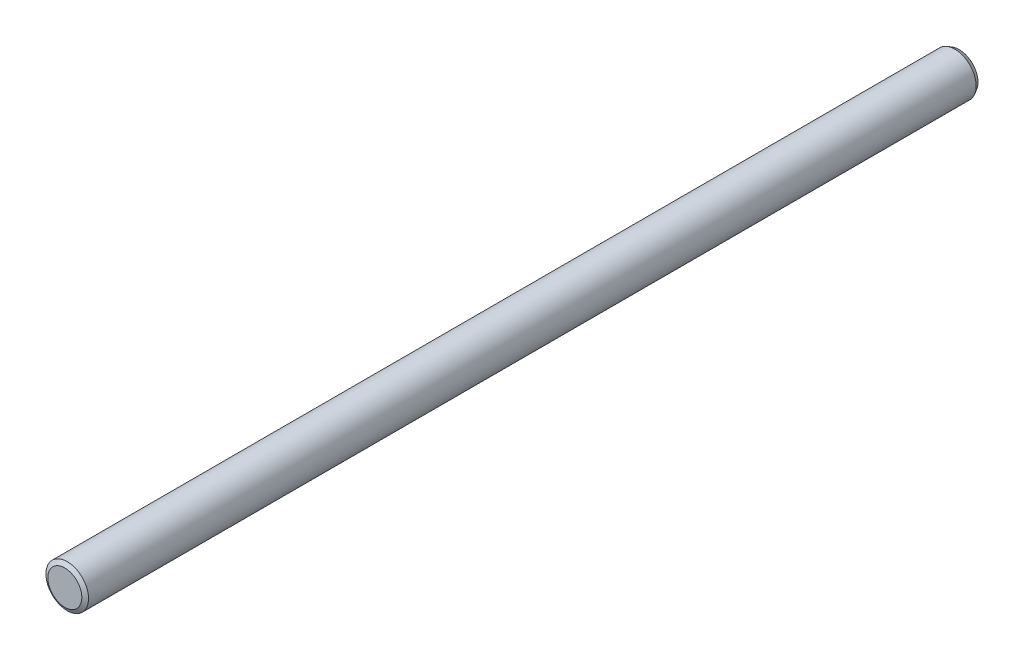
ISO-10303-21;
HEADER;
FILE_DESCRIPTION(('STEP AP214'),'2;1');
FILE_NAME('part.step','',(''),(''),'','','');
FILE_SCHEMA(('AUTOMOTIVE_DESIGN { 1 0 10303 214 1 1 1 1 }'));
ENDSEC;
DATA;
#1=APPLICATION_CONTEXT('core data for automotive mechanical design processes');
#2=APPLICATION_PROTOCOL_DEFINITION('international standard','automotive_design',2000,#1);
#3=PRODUCT_CONTEXT('',#1,'mechanical');
#4=PRODUCT('Part','Part','',(#3));
#5=PRODUCT_RELATED_PRODUCT_CATEGORY('part','',(#4));
#6=PRODUCT_DEFINITION_FORMATION('','',#4);
#7=PRODUCT_DEFINITION_CONTEXT('part definition',#1,'design');
#8=PRODUCT_DEFINITION('design','',#6,#7);
#9=PRODUCT_DEFINITION_SHAPE('','',#8);
#10=(LENGTH_UNIT() NAMED_UNIT(*) SI_UNIT(.MILLI.,.METRE.));
#11=(NAMED_UNIT(*) PLANE_ANGLE_UNIT() SI_UNIT($,.RADIAN.));
#12=(NAMED_UNIT(*) SI_UNIT($,.STERADIAN.) SOLID_ANGLE_UNIT());
#13=UNCERTAINTY_MEASURE_WITH_UNIT(LENGTH_MEASURE(1.E-05),#10,'distance_accuracy_value','');
#14=(GEOMETRIC_REPRESENTATION_CONTEXT(3) GLOBAL_UNCERTAINTY_ASSIGNED_CONTEXT((#13)) GLOBAL_UNIT_ASSIGNED_CONTEXT((#10,
#11,#12)) REPRESENTATION_CONTEXT('',''));
#15=CARTESIAN_POINT('',(0.,0.,0.));
#16=DIRECTION('',(0.,0.,1.));
#17=DIRECTION('',(1.,0.,0.));
#18=AXIS2_PLACEMENT_3D('',#15,#16,#17);
#19=CARTESIAN_POINT('',(0.25,20.5091406768537,10.5));
#20=DIRECTION('',(0.,0.,-1.));
#21=DIRECTION('',(-1.,0.,0.));
#22=AXIS2_PLACEMENT_3D('',#19,#20,#21);
#23=CYLINDRICAL_SURFACE('',#22,0.25);
#24=CARTESIAN_POINT('',(0.25,20.5091406768537,10.4711324865405));
#25=DIRECTION('',(0.,0.,1.));
#26=DIRECTION('',(1.,0.,0.));
#27=AXIS2_PLACEMENT_3D('',#24,#25,#26);
#28=CIRCLE('',#27,0.25);
#29=CARTESIAN_POINT('',(0.5,20.5091406768537,10.4711324865405));
#30=VERTEX_POINT('',#29);
#31=EDGE_CURVE('E37',#30,#30,#28,.F.);
#32=ORIENTED_EDGE('',*,*,#31,.T.);
#33=EDGE_LOOP('',(#32));
#34=FACE_BOUND('',#33,.T.);
#35=CARTESIAN_POINT('',(0.25,20.5091406768537,0.0499999999999962));
#36=DIRECTION('',(0.,0.,1.));
#37=DIRECTION('',(1.,0.,0.));
#38=AXIS2_PLACEMENT_3D('',#35,#36,#37);
#39=CIRCLE('',#38,0.25);
#40=CARTESIAN_POINT('',(0.5,20.5091406768537,0.0499999999999962));
#41=VERTEX_POINT('',#40);
#42=EDGE_CURVE('E41',#41,#41,#39,.T.);
#43=ORIENTED_EDGE('',*,*,#42,.T.);
#44=EDGE_LOOP('',(#43));
#45=FACE_BOUND('',#44,.T.);
#46=ADVANCED_FACE('F30',(#34,#45),#23,.T.);
#47=CARTESIAN_POINT('',(0.25,20.5091406768537,10.5));
#48=DIRECTION('',(0.,0.,1.));
#49=DIRECTION('',(1.,0.,0.));
#50=AXIS2_PLACEMENT_3D('',#47,#48,#49);
#51=PLANE('',#50);
#52=CARTESIAN_POINT('',(0.25,20.5091406768537,10.5));
#53=DIRECTION('',(0.,0.,1.));
#54=DIRECTION('',(1.,0.,0.));
#55=AXIS2_PLACEMENT_3D('',#52,#53,#54);
#56=CIRCLE('',#55,0.199999999999995);
#57=CARTESIAN_POINT('',(0.449999999999996,20.5091406768537,10.5));
#58=VERTEX_POINT('',#57);
#59=EDGE_CURVE('E45',#58,#58,#56,.T.);
#60=ORIENTED_EDGE('',*,*,#59,.T.);
#61=EDGE_LOOP('',(#60));
#62=FACE_BOUND('',#61,.T.);
#63=ADVANCED_FACE('F51',(#62),#51,.T.);
#64=CARTESIAN_POINT('',(0.25,20.5091406768537,0.));
#65=DIRECTION('',(0.,0.,1.));
#66=DIRECTION('',(1.,0.,0.));
#67=AXIS2_PLACEMENT_3D('',#64,#65,#66);
#68=PLANE('',#67);
#69=CARTESIAN_POINT('',(0.25,20.5091406768537,0.));
#70=DIRECTION('',(0.,0.,1.));
#71=DIRECTION('',(1.,0.,0.));
#72=AXIS2_PLACEMENT_3D('',#69,#70,#71);
#73=CIRCLE('',#72,0.221132486540519);
#74=CARTESIAN_POINT('',(0.47113248654052,20.5091406768537,0.));
#75=VERTEX_POINT('',#74);
#76=EDGE_CURVE('E10',#75,#75,#73,.F.);
#77=ORIENTED_EDGE('',*,*,#76,.T.);
#78=EDGE_LOOP('',(#77));
#79=FACE_BOUND('',#78,.T.);
#80=ADVANCED_FACE('F55',(#79),#68,.F.);
#81=CARTESIAN_POINT('',(0.25,20.5091406768537,10.5));
#82=DIRECTION('',(0.,0.,-1.));
#83=DIRECTION('',(-1.,0.,0.));
#84=AXIS2_PLACEMENT_3D('',#81,#82,#83);
#85=CONICAL_SURFACE('',#84,0.199999999999995,1.04719755119658);
#86=ORIENTED_EDGE('',*,*,#31,.F.);
#87=EDGE_LOOP('',(#86));
#88=FACE_BOUND('',#87,.T.);
#89=ORIENTED_EDGE('',*,*,#59,.F.);
#90=EDGE_LOOP('',(#89));
#91=FACE_BOUND('',#90,.T.);
#92=ADVANCED_FACE('F53',(#88,#91),#85,.T.);
#93=CARTESIAN_POINT('',(0.25,20.5091406768537,0.0499999999999962));
#94=DIRECTION('',(0.,0.,1.));
#95=DIRECTION('',(1.,0.,0.));
#96=AXIS2_PLACEMENT_3D('',#93,#94,#95);
#97=CONICAL_SURFACE('',#96,0.25,0.523598775598314);
#98=ORIENTED_EDGE('',*,*,#76,.F.);
#99=EDGE_LOOP('',(#98));
#100=FACE_BOUND('',#99,.T.);
#101=ORIENTED_EDGE('',*,*,#42,.F.);
#102=EDGE_LOOP('',(#101));
#103=FACE_BOUND('',#102,.T.);
#104=ADVANCED_FACE('F32',(#100,#103),#97,.T.);
#105=CLOSED_SHELL('',(#46,#63,#80,#92,#104));
#106=MANIFOLD_SOLID_BREP('B2',#105);
#107=ADVANCED_BREP_SHAPE_REPRESENTATION('',(#18,#106),#14);
#108=SHAPE_DEFINITION_REPRESENTATION(#9,#107);
ENDSEC;
END-ISO-10303-21;
